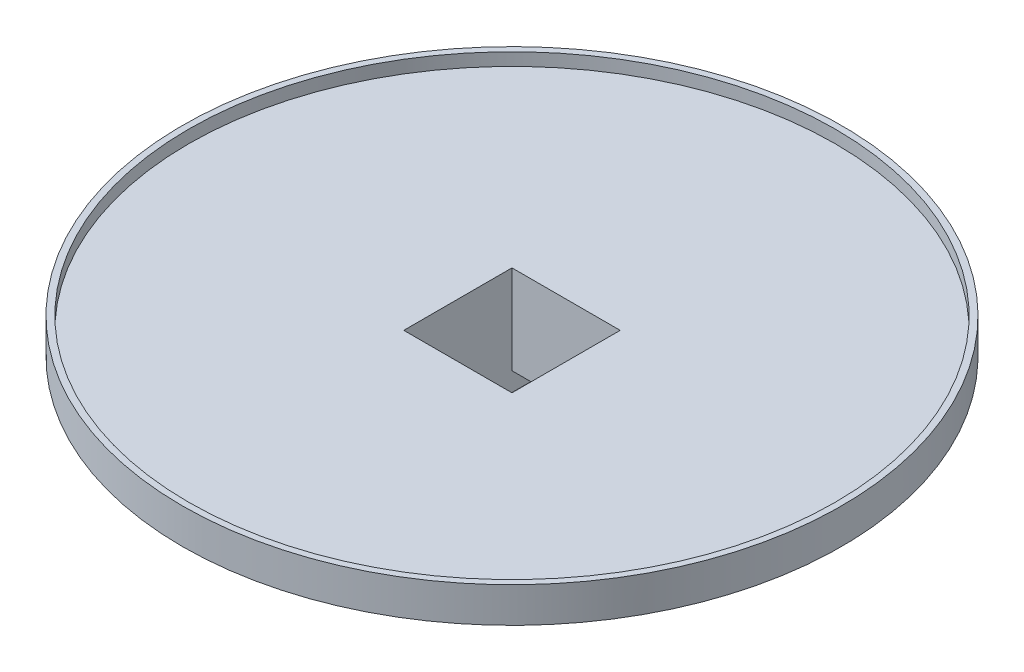
ISO-10303-21;
HEADER;
FILE_DESCRIPTION(('STEP AP214'),'2;1');
FILE_NAME('part.step','',(''),(''),'','','');
FILE_SCHEMA(('AUTOMOTIVE_DESIGN { 1 0 10303 214 1 1 1 1 }'));
ENDSEC;
DATA;
#1=APPLICATION_CONTEXT('core data for automotive mechanical design processes');
#2=APPLICATION_PROTOCOL_DEFINITION('international standard','automotive_design',2000,#1);
#3=PRODUCT_CONTEXT('',#1,'mechanical');
#4=PRODUCT('Part','Part','',(#3));
#5=PRODUCT_RELATED_PRODUCT_CATEGORY('part','',(#4));
#6=PRODUCT_DEFINITION_FORMATION('','',#4);
#7=PRODUCT_DEFINITION_CONTEXT('part definition',#1,'design');
#8=PRODUCT_DEFINITION('design','',#6,#7);
#9=PRODUCT_DEFINITION_SHAPE('','',#8);
#10=(LENGTH_UNIT() NAMED_UNIT(*) SI_UNIT(.MILLI.,.METRE.));
#11=(NAMED_UNIT(*) PLANE_ANGLE_UNIT() SI_UNIT($,.RADIAN.));
#12=(NAMED_UNIT(*) SI_UNIT($,.STERADIAN.) SOLID_ANGLE_UNIT());
#13=UNCERTAINTY_MEASURE_WITH_UNIT(LENGTH_MEASURE(1.E-05),#10,'distance_accuracy_value','');
#14=(GEOMETRIC_REPRESENTATION_CONTEXT(3) GLOBAL_UNCERTAINTY_ASSIGNED_CONTEXT((#13)) GLOBAL_UNIT_ASSIGNED_CONTEXT((#10,
#11,#12)) REPRESENTATION_CONTEXT('',''));
#15=CARTESIAN_POINT('',(0.,0.,0.));
#16=DIRECTION('',(0.,0.,1.));
#17=DIRECTION('',(1.,0.,0.));
#18=AXIS2_PLACEMENT_3D('',#15,#16,#17);
#19=CARTESIAN_POINT('',(0.,-7.08,0.));
#20=DIRECTION('',(0.,-1.,0.));
#21=DIRECTION('',(0.,0.,-1.));
#22=AXIS2_PLACEMENT_3D('',#19,#20,#21);
#23=PLANE('',#22);
#24=DIRECTION('',(0.,0.,1.));
#25=VECTOR('',#24,1.);
#26=CARTESIAN_POINT('',(-4.3,-7.08,-14.1));
#27=LINE('',#26,#25);
#28=CARTESIAN_POINT('',(-4.3,-7.08,-6.3874877690685));
#29=VERTEX_POINT('',#28);
#30=CARTESIAN_POINT('',(-4.3,-7.08,-4.3));
#31=VERTEX_POINT('',#30);
#32=EDGE_CURVE('E127',#29,#31,#27,.T.);
#33=ORIENTED_EDGE('',*,*,#32,.F.);
#34=CARTESIAN_POINT('',(0.,-7.08,0.));
#35=DIRECTION('',(0.,-1.,0.));
#36=DIRECTION('',(0.,0.,-1.));
#37=AXIS2_PLACEMENT_3D('',#34,#35,#36);
#38=CIRCLE('',#37,7.69999999999999);
#39=CARTESIAN_POINT('',(4.3,-7.08,-6.38748776906849));
#40=VERTEX_POINT('',#39);
#41=EDGE_CURVE('E246',#29,#40,#38,.T.);
#42=ORIENTED_EDGE('',*,*,#41,.T.);
#43=DIRECTION('',(0.,0.,1.));
#44=VECTOR('',#43,1.);
#45=CARTESIAN_POINT('',(4.3,-7.08,-14.1));
#46=LINE('',#45,#44);
#47=CARTESIAN_POINT('',(4.3,-7.08,-4.3));
#48=VERTEX_POINT('',#47);
#49=EDGE_CURVE('E112',#40,#48,#46,.T.);
#50=ORIENTED_EDGE('',*,*,#49,.T.);
#51=DIRECTION('',(1.,0.,0.));
#52=VECTOR('',#51,1.);
#53=CARTESIAN_POINT('',(-4.3,-7.08,-4.3));
#54=LINE('',#53,#52);
#55=EDGE_CURVE('E284',#31,#48,#54,.T.);
#56=ORIENTED_EDGE('',*,*,#55,.F.);
#57=EDGE_LOOP('',(#33,#42,#50,#56));
#58=FACE_BOUND('',#57,.T.);
#59=ADVANCED_FACE('F101',(#58),#23,.T.);
#60=CARTESIAN_POINT('',(4.3,-7.08,4.3));
#61=VERTEX_POINT('',#60);
#62=CARTESIAN_POINT('',(4.3,-7.08,6.38748776906852));
#63=VERTEX_POINT('',#62);
#64=EDGE_CURVE('E12',#61,#63,#46,.T.);
#65=ORIENTED_EDGE('',*,*,#64,.T.);
#66=CARTESIAN_POINT('',(-4.3,-7.08,6.38748776906853));
#67=VERTEX_POINT('',#66);
#68=EDGE_CURVE('E249',#63,#67,#38,.T.);
#69=ORIENTED_EDGE('',*,*,#68,.T.);
#70=CARTESIAN_POINT('',(-4.3,-7.08,4.3));
#71=VERTEX_POINT('',#70);
#72=EDGE_CURVE('E320',#71,#67,#27,.T.);
#73=ORIENTED_EDGE('',*,*,#72,.F.);
#74=DIRECTION('',(-1.,0.,0.));
#75=VECTOR('',#74,1.);
#76=CARTESIAN_POINT('',(-4.3,-7.08,4.3));
#77=LINE('',#76,#75);
#78=EDGE_CURVE('E281',#61,#71,#77,.T.);
#79=ORIENTED_EDGE('',*,*,#78,.F.);
#80=EDGE_LOOP('',(#65,#69,#73,#79));
#81=FACE_BOUND('',#80,.T.);
#82=ADVANCED_FACE('F325',(#81),#23,.T.);
#83=CARTESIAN_POINT('',(0.,-81.1565063971027,0.));
#84=DIRECTION('',(0.,1.,0.));
#85=DIRECTION('',(0.,0.,1.));
#86=AXIS2_PLACEMENT_3D('',#83,#84,#85);
#87=CYLINDRICAL_SURFACE('',#86,26.19);
#88=CARTESIAN_POINT('',(0.,1.01,0.));
#89=DIRECTION('',(0.,1.,0.));
#90=DIRECTION('',(0.,0.,1.));
#91=AXIS2_PLACEMENT_3D('',#88,#89,#90);
#92=CIRCLE('',#91,26.19);
#93=CARTESIAN_POINT('',(0.,1.01,26.19));
#94=VERTEX_POINT('',#93);
#95=EDGE_CURVE('E370',#94,#94,#92,.T.);
#96=ORIENTED_EDGE('',*,*,#95,.F.);
#97=EDGE_LOOP('',(#96));
#98=FACE_BOUND('',#97,.T.);
#99=CARTESIAN_POINT('',(0.,-1.79,0.));
#100=DIRECTION('',(0.,-1.,0.));
#101=DIRECTION('',(0.,0.,-1.));
#102=AXIS2_PLACEMENT_3D('',#99,#100,#101);
#103=CIRCLE('',#102,26.19);
#104=CARTESIAN_POINT('',(0.,-1.79,-26.19));
#105=VERTEX_POINT('',#104);
#106=EDGE_CURVE('E250',#105,#105,#103,.T.);
#107=ORIENTED_EDGE('',*,*,#106,.F.);
#108=EDGE_LOOP('',(#107));
#109=FACE_BOUND('',#108,.T.);
#110=ADVANCED_FACE('F311',(#98,#109),#87,.T.);
#111=CARTESIAN_POINT('',(0.,0.,0.));
#112=DIRECTION('',(0.,-1.,0.));
#113=DIRECTION('',(0.,0.,-1.));
#114=AXIS2_PLACEMENT_3D('',#111,#112,#113);
#115=PLANE('',#114);
#116=CARTESIAN_POINT('',(0.,0.,0.));
#117=DIRECTION('',(0.,-1.,0.));
#118=DIRECTION('',(0.,0.,-1.));
#119=AXIS2_PLACEMENT_3D('',#116,#117,#118);
#120=CIRCLE('',#119,25.69);
#121=CARTESIAN_POINT('',(0.,0.,-25.69));
#122=VERTEX_POINT('',#121);
#123=EDGE_CURVE('E105',#122,#122,#120,.T.);
#124=ORIENTED_EDGE('',*,*,#123,.F.);
#125=EDGE_LOOP('',(#124));
#126=FACE_BOUND('',#125,.T.);
#127=DIRECTION('',(0.,0.,1.));
#128=VECTOR('',#127,1.);
#129=CARTESIAN_POINT('',(4.3,0.,-4.3));
#130=LINE('',#129,#128);
#131=CARTESIAN_POINT('',(4.3,0.,-4.3));
#132=VERTEX_POINT('',#131);
#133=CARTESIAN_POINT('',(4.3,0.,4.3));
#134=VERTEX_POINT('',#133);
#135=EDGE_CURVE('E271',#132,#134,#130,.T.);
#136=ORIENTED_EDGE('',*,*,#135,.T.);
#137=DIRECTION('',(-1.,0.,0.));
#138=VECTOR('',#137,1.);
#139=CARTESIAN_POINT('',(-4.3,0.,4.3));
#140=LINE('',#139,#138);
#141=CARTESIAN_POINT('',(-4.3,0.,4.3));
#142=VERTEX_POINT('',#141);
#143=EDGE_CURVE('E289',#134,#142,#140,.T.);
#144=ORIENTED_EDGE('',*,*,#143,.T.);
#145=DIRECTION('',(0.,0.,-1.));
#146=VECTOR('',#145,1.);
#147=CARTESIAN_POINT('',(-4.3,0.,-4.3));
#148=LINE('',#147,#146);
#149=CARTESIAN_POINT('',(-4.3,0.,-4.3));
#150=VERTEX_POINT('',#149);
#151=EDGE_CURVE('E292',#142,#150,#148,.T.);
#152=ORIENTED_EDGE('',*,*,#151,.T.);
#153=DIRECTION('',(1.,0.,0.));
#154=VECTOR('',#153,1.);
#155=CARTESIAN_POINT('',(-4.3,0.,-4.3));
#156=LINE('',#155,#154);
#157=EDGE_CURVE('E285',#150,#132,#156,.T.);
#158=ORIENTED_EDGE('',*,*,#157,.T.);
#159=EDGE_LOOP('',(#136,#144,#152,#158));
#160=FACE_BOUND('',#159,.T.);
#161=ADVANCED_FACE('F103',(#126,#160),#115,.F.);
#162=CARTESIAN_POINT('',(4.3,-7.08,-4.3));
#163=DIRECTION('',(-1.,0.,0.));
#164=DIRECTION('',(0.,0.,1.));
#165=AXIS2_PLACEMENT_3D('',#162,#163,#164);
#166=PLANE('',#165);
#167=ORIENTED_EDGE('',*,*,#135,.F.);
#168=DIRECTION('',(0.,1.,0.));
#169=VECTOR('',#168,1.);
#170=CARTESIAN_POINT('',(4.3,-7.08,-4.3));
#171=LINE('',#170,#169);
#172=EDGE_CURVE('E260',#48,#132,#171,.T.);
#173=ORIENTED_EDGE('',*,*,#172,.F.);
#174=ORIENTED_EDGE('',*,*,#49,.F.);
#175=CARTESIAN_POINT('',(4.3,-7.08,-14.1));
#176=VERTEX_POINT('',#175);
#177=EDGE_CURVE('E111',#176,#40,#46,.T.);
#178=ORIENTED_EDGE('',*,*,#177,.F.);
#179=DIRECTION('',(0.,1.,0.));
#180=VECTOR('',#179,1.);
#181=CARTESIAN_POINT('',(4.3,-8.58,-14.1));
#182=LINE('',#181,#180);
#183=CARTESIAN_POINT('',(4.3,-8.58,-14.1));
#184=VERTEX_POINT('',#183);
#185=EDGE_CURVE('E275',#184,#176,#182,.T.);
#186=ORIENTED_EDGE('',*,*,#185,.F.);
#187=DIRECTION('',(0.,0.,1.));
#188=VECTOR('',#187,1.);
#189=CARTESIAN_POINT('',(4.3,-8.58,-14.1));
#190=LINE('',#189,#188);
#191=CARTESIAN_POINT('',(4.3,-8.58,9.9));
#192=VERTEX_POINT('',#191);
#193=EDGE_CURVE('E428',#184,#192,#190,.T.);
#194=ORIENTED_EDGE('',*,*,#193,.T.);
#195=DIRECTION('',(0.,1.,0.));
#196=VECTOR('',#195,1.);
#197=CARTESIAN_POINT('',(4.3,-8.58,9.9));
#198=LINE('',#197,#196);
#199=CARTESIAN_POINT('',(4.3,-7.08,9.9));
#200=VERTEX_POINT('',#199);
#201=EDGE_CURVE('E272',#192,#200,#198,.T.);
#202=ORIENTED_EDGE('',*,*,#201,.T.);
#203=DIRECTION('',(0.,0.,-1.));
#204=VECTOR('',#203,1.);
#205=CARTESIAN_POINT('',(4.3,-7.08,-4.3));
#206=LINE('',#205,#204);
#207=EDGE_CURVE('E326',#200,#63,#206,.T.);
#208=ORIENTED_EDGE('',*,*,#207,.T.);
#209=ORIENTED_EDGE('',*,*,#64,.F.);
#210=DIRECTION('',(0.,1.,0.));
#211=VECTOR('',#210,1.);
#212=CARTESIAN_POINT('',(4.3,-7.08,4.3));
#213=LINE('',#212,#211);
#214=EDGE_CURVE('E301',#61,#134,#213,.T.);
#215=ORIENTED_EDGE('',*,*,#214,.T.);
#216=EDGE_LOOP('',(#167,#173,#174,#178,#186,#194,#202,#208,#209,#215));
#217=FACE_BOUND('',#216,.T.);
#218=ADVANCED_FACE('F258',(#217),#166,.T.);
#219=CARTESIAN_POINT('',(-4.3,-7.08,4.3));
#220=DIRECTION('',(0.,0.,-1.));
#221=DIRECTION('',(-1.,0.,0.));
#222=AXIS2_PLACEMENT_3D('',#219,#220,#221);
#223=PLANE('',#222);
#224=ORIENTED_EDGE('',*,*,#143,.F.);
#225=ORIENTED_EDGE('',*,*,#214,.F.);
#226=ORIENTED_EDGE('',*,*,#78,.T.);
#227=DIRECTION('',(0.,1.,0.));
#228=VECTOR('',#227,1.);
#229=CARTESIAN_POINT('',(-4.3,-7.08,4.3));
#230=LINE('',#229,#228);
#231=EDGE_CURVE('E300',#71,#142,#230,.T.);
#232=ORIENTED_EDGE('',*,*,#231,.T.);
#233=EDGE_LOOP('',(#224,#225,#226,#232));
#234=FACE_BOUND('',#233,.T.);
#235=ADVANCED_FACE('F322',(#234),#223,.T.);
#236=CARTESIAN_POINT('',(-4.3,-7.08,-4.3));
#237=DIRECTION('',(1.,0.,0.));
#238=DIRECTION('',(0.,0.,-1.));
#239=AXIS2_PLACEMENT_3D('',#236,#237,#238);
#240=PLANE('',#239);
#241=ORIENTED_EDGE('',*,*,#151,.F.);
#242=ORIENTED_EDGE('',*,*,#231,.F.);
#243=ORIENTED_EDGE('',*,*,#72,.T.);
#244=DIRECTION('',(0.,0.,1.));
#245=VECTOR('',#244,1.);
#246=CARTESIAN_POINT('',(-4.3,-7.08,-4.3));
#247=LINE('',#246,#245);
#248=CARTESIAN_POINT('',(-4.3,-7.08,9.9));
#249=VERTEX_POINT('',#248);
#250=EDGE_CURVE('E330',#67,#249,#247,.T.);
#251=ORIENTED_EDGE('',*,*,#250,.T.);
#252=DIRECTION('',(0.,1.,0.));
#253=VECTOR('',#252,1.);
#254=CARTESIAN_POINT('',(-4.3,-8.58,9.9));
#255=LINE('',#254,#253);
#256=CARTESIAN_POINT('',(-4.3,-8.58,9.9));
#257=VERTEX_POINT('',#256);
#258=EDGE_CURVE('E381',#257,#249,#255,.T.);
#259=ORIENTED_EDGE('',*,*,#258,.F.);
#260=DIRECTION('',(0.,0.,1.));
#261=VECTOR('',#260,1.);
#262=CARTESIAN_POINT('',(-4.3,-8.58,-14.1));
#263=LINE('',#262,#261);
#264=CARTESIAN_POINT('',(-4.3,-8.58,-14.1));
#265=VERTEX_POINT('',#264);
#266=EDGE_CURVE('E377',#265,#257,#263,.T.);
#267=ORIENTED_EDGE('',*,*,#266,.F.);
#268=DIRECTION('',(0.,1.,0.));
#269=VECTOR('',#268,1.);
#270=CARTESIAN_POINT('',(-4.3,-8.58,-14.1));
#271=LINE('',#270,#269);
#272=CARTESIAN_POINT('',(-4.3,-7.08,-14.1));
#273=VERTEX_POINT('',#272);
#274=EDGE_CURVE('E373',#265,#273,#271,.T.);
#275=ORIENTED_EDGE('',*,*,#274,.T.);
#276=EDGE_CURVE('E386',#273,#29,#27,.T.);
#277=ORIENTED_EDGE('',*,*,#276,.T.);
#278=ORIENTED_EDGE('',*,*,#32,.T.);
#279=DIRECTION('',(0.,1.,0.));
#280=VECTOR('',#279,1.);
#281=CARTESIAN_POINT('',(-4.3,-7.08,-4.3));
#282=LINE('',#281,#280);
#283=EDGE_CURVE('E298',#31,#150,#282,.T.);
#284=ORIENTED_EDGE('',*,*,#283,.T.);
#285=EDGE_LOOP('',(#241,#242,#243,#251,#259,#267,#275,#277,#278,#284));
#286=FACE_BOUND('',#285,.T.);
#287=ADVANCED_FACE('F316',(#286),#240,.T.);
#288=CARTESIAN_POINT('',(-4.3,-7.08,-4.3));
#289=DIRECTION('',(0.,0.,1.));
#290=DIRECTION('',(1.,0.,0.));
#291=AXIS2_PLACEMENT_3D('',#288,#289,#290);
#292=PLANE('',#291);
#293=ORIENTED_EDGE('',*,*,#157,.F.);
#294=ORIENTED_EDGE('',*,*,#283,.F.);
#295=ORIENTED_EDGE('',*,*,#55,.T.);
#296=ORIENTED_EDGE('',*,*,#172,.T.);
#297=EDGE_LOOP('',(#293,#294,#295,#296));
#298=FACE_BOUND('',#297,.T.);
#299=ADVANCED_FACE('F314',(#298),#292,.T.);
#300=CARTESIAN_POINT('',(0.,-8.58,0.));
#301=DIRECTION('',(0.,1.,0.));
#302=DIRECTION('',(0.,0.,1.));
#303=AXIS2_PLACEMENT_3D('',#300,#301,#302);
#304=PLANE('',#303);
#305=DIRECTION('',(0.,0.,-1.));
#306=VECTOR('',#305,1.);
#307=CARTESIAN_POINT('',(9.9,-8.58,-8.1));
#308=LINE('',#307,#306);
#309=CARTESIAN_POINT('',(9.9,-8.58,-8.1));
#310=VERTEX_POINT('',#309);
#311=CARTESIAN_POINT('',(9.9,-8.58,-11.1));
#312=VERTEX_POINT('',#311);
#313=EDGE_CURVE('E351',#310,#312,#308,.T.);
#314=ORIENTED_EDGE('',*,*,#313,.T.);
#315=DIRECTION('',(1.,0.,0.));
#316=VECTOR('',#315,1.);
#317=CARTESIAN_POINT('',(5.9,-8.58,-11.1));
#318=LINE('',#317,#316);
#319=CARTESIAN_POINT('',(5.9,-8.58,-11.1));
#320=VERTEX_POINT('',#319);
#321=EDGE_CURVE('E119',#320,#312,#318,.T.);
#322=ORIENTED_EDGE('',*,*,#321,.F.);
#323=DIRECTION('',(0.,0.,-1.));
#324=VECTOR('',#323,1.);
#325=CARTESIAN_POINT('',(5.9,-8.58,-8.1));
#326=LINE('',#325,#324);
#327=CARTESIAN_POINT('',(5.9,-8.58,-8.1));
#328=VERTEX_POINT('',#327);
#329=EDGE_CURVE('E342',#328,#320,#326,.T.);
#330=ORIENTED_EDGE('',*,*,#329,.F.);
#331=DIRECTION('',(1.,0.,0.));
#332=VECTOR('',#331,1.);
#333=CARTESIAN_POINT('',(5.9,-8.58,-8.1));
#334=LINE('',#333,#332);
#335=EDGE_CURVE('E355',#328,#310,#334,.T.);
#336=ORIENTED_EDGE('',*,*,#335,.T.);
#337=EDGE_LOOP('',(#314,#322,#330,#336));
#338=FACE_BOUND('',#337,.T.);
#339=DIRECTION('',(0.,0.,-1.));
#340=VECTOR('',#339,1.);
#341=CARTESIAN_POINT('',(12.5,-8.58,9.9));
#342=LINE('',#341,#340);
#343=CARTESIAN_POINT('',(12.5,-8.58,9.9));
#344=VERTEX_POINT('',#343);
#345=CARTESIAN_POINT('',(12.5,-8.58,-14.1));
#346=VERTEX_POINT('',#345);
#347=EDGE_CURVE('E267',#344,#346,#342,.T.);
#348=ORIENTED_EDGE('',*,*,#347,.F.);
#349=DIRECTION('',(-1.,0.,0.));
#350=VECTOR('',#349,1.);
#351=CARTESIAN_POINT('',(12.5,-8.58,9.9));
#352=LINE('',#351,#350);
#353=EDGE_CURVE('E280',#344,#192,#352,.T.);
#354=ORIENTED_EDGE('',*,*,#353,.T.);
#355=ORIENTED_EDGE('',*,*,#193,.F.);
#356=DIRECTION('',(-1.,0.,0.));
#357=VECTOR('',#356,1.);
#358=CARTESIAN_POINT('',(12.5,-8.58,-14.1));
#359=LINE('',#358,#357);
#360=EDGE_CURVE('E425',#346,#184,#359,.T.);
#361=ORIENTED_EDGE('',*,*,#360,.F.);
#362=EDGE_LOOP('',(#348,#354,#355,#361));
#363=FACE_BOUND('',#362,.T.);
#364=CARTESIAN_POINT('',(10.75,-8.58,-12.5));
#365=DIRECTION('',(0.,-1.,0.));
#366=DIRECTION('',(0.,0.,-1.));
#367=AXIS2_PLACEMENT_3D('',#364,#365,#366);
#368=CIRCLE('',#367,1.125);
#369=CARTESIAN_POINT('',(10.75,-8.58,-13.625));
#370=VERTEX_POINT('',#369);
#371=EDGE_CURVE('E416',#370,#370,#368,.T.);
#372=ORIENTED_EDGE('',*,*,#371,.F.);
#373=EDGE_LOOP('',(#372));
#374=FACE_BOUND('',#373,.T.);
#375=CARTESIAN_POINT('',(10.75,-8.58,0.3));
#376=DIRECTION('',(0.,-1.,0.));
#377=DIRECTION('',(0.,0.,-1.));
#378=AXIS2_PLACEMENT_3D('',#375,#376,#377);
#379=CIRCLE('',#378,1.125);
#380=CARTESIAN_POINT('',(10.75,-8.58,-0.825));
#381=VERTEX_POINT('',#380);
#382=EDGE_CURVE('E413',#381,#381,#379,.T.);
#383=ORIENTED_EDGE('',*,*,#382,.F.);
#384=EDGE_LOOP('',(#383));
#385=FACE_BOUND('',#384,.T.);
#386=ADVANCED_FACE('F439',(#338,#363,#374,#385),#304,.F.);
#387=CARTESIAN_POINT('',(12.5,-8.58,9.9));
#388=DIRECTION('',(1.,0.,0.));
#389=DIRECTION('',(0.,0.,-1.));
#390=AXIS2_PLACEMENT_3D('',#387,#388,#389);
#391=PLANE('',#390);
#392=DIRECTION('',(0.,0.,-1.));
#393=VECTOR('',#392,1.);
#394=CARTESIAN_POINT('',(12.5,-7.08,9.9));
#395=LINE('',#394,#393);
#396=CARTESIAN_POINT('',(12.5,-7.08,9.9));
#397=VERTEX_POINT('',#396);
#398=CARTESIAN_POINT('',(12.5,-7.08,-14.1));
#399=VERTEX_POINT('',#398);
#400=EDGE_CURVE('E261',#397,#399,#395,.T.);
#401=ORIENTED_EDGE('',*,*,#400,.F.);
#402=DIRECTION('',(0.,1.,0.));
#403=VECTOR('',#402,1.);
#404=CARTESIAN_POINT('',(12.5,-8.58,9.9));
#405=LINE('',#404,#403);
#406=EDGE_CURVE('E268',#344,#397,#405,.T.);
#407=ORIENTED_EDGE('',*,*,#406,.F.);
#408=ORIENTED_EDGE('',*,*,#347,.T.);
#409=DIRECTION('',(0.,1.,0.));
#410=VECTOR('',#409,1.);
#411=CARTESIAN_POINT('',(12.5,-8.58,-14.1));
#412=LINE('',#411,#410);
#413=EDGE_CURVE('E277',#346,#399,#412,.T.);
#414=ORIENTED_EDGE('',*,*,#413,.T.);
#415=EDGE_LOOP('',(#401,#407,#408,#414));
#416=FACE_BOUND('',#415,.T.);
#417=ADVANCED_FACE('F432',(#416),#391,.T.);
#418=CARTESIAN_POINT('',(12.5,-8.58,9.9));
#419=DIRECTION('',(0.,0.,-1.));
#420=DIRECTION('',(-1.,0.,0.));
#421=AXIS2_PLACEMENT_3D('',#418,#419,#420);
#422=PLANE('',#421);
#423=DIRECTION('',(-1.,0.,0.));
#424=VECTOR('',#423,1.);
#425=CARTESIAN_POINT('',(12.5,-7.08,9.9));
#426=LINE('',#425,#424);
#427=EDGE_CURVE('E241',#397,#200,#426,.T.);
#428=ORIENTED_EDGE('',*,*,#427,.T.);
#429=ORIENTED_EDGE('',*,*,#201,.F.);
#430=ORIENTED_EDGE('',*,*,#353,.F.);
#431=ORIENTED_EDGE('',*,*,#406,.T.);
#432=EDGE_LOOP('',(#428,#429,#430,#431));
#433=FACE_BOUND('',#432,.T.);
#434=ADVANCED_FACE('F443',(#433),#422,.F.);
#435=CARTESIAN_POINT('',(12.5,-8.58,-14.1));
#436=DIRECTION('',(0.,0.,-1.));
#437=DIRECTION('',(-1.,0.,0.));
#438=AXIS2_PLACEMENT_3D('',#435,#436,#437);
#439=PLANE('',#438);
#440=DIRECTION('',(-1.,0.,0.));
#441=VECTOR('',#440,1.);
#442=CARTESIAN_POINT('',(12.5,-7.08,-14.1));
#443=LINE('',#442,#441);
#444=EDGE_CURVE('E237',#399,#176,#443,.T.);
#445=ORIENTED_EDGE('',*,*,#444,.F.);
#446=ORIENTED_EDGE('',*,*,#413,.F.);
#447=ORIENTED_EDGE('',*,*,#360,.T.);
#448=ORIENTED_EDGE('',*,*,#185,.T.);
#449=EDGE_LOOP('',(#445,#446,#447,#448));
#450=FACE_BOUND('',#449,.T.);
#451=ADVANCED_FACE('F436',(#450),#439,.T.);
#452=CARTESIAN_POINT('',(10.75,-8.58,-12.5));
#453=DIRECTION('',(0.,1.,0.));
#454=DIRECTION('',(0.,0.,1.));
#455=AXIS2_PLACEMENT_3D('',#452,#453,#454);
#456=CYLINDRICAL_SURFACE('',#455,1.125);
#457=ORIENTED_EDGE('',*,*,#371,.T.);
#458=EDGE_LOOP('',(#457));
#459=FACE_BOUND('',#458,.T.);
#460=CARTESIAN_POINT('',(10.75,-7.08,-12.5));
#461=DIRECTION('',(0.,-1.,0.));
#462=DIRECTION('',(0.,0.,-1.));
#463=AXIS2_PLACEMENT_3D('',#460,#461,#462);
#464=CIRCLE('',#463,1.125);
#465=CARTESIAN_POINT('',(10.75,-7.08,-13.625));
#466=VERTEX_POINT('',#465);
#467=EDGE_CURVE('E352',#466,#466,#464,.T.);
#468=ORIENTED_EDGE('',*,*,#467,.F.);
#469=EDGE_LOOP('',(#468));
#470=FACE_BOUND('',#469,.T.);
#471=ADVANCED_FACE('F450',(#459,#470),#456,.F.);
#472=CARTESIAN_POINT('',(10.75,-8.58,0.3));
#473=DIRECTION('',(0.,1.,0.));
#474=DIRECTION('',(0.,0.,1.));
#475=AXIS2_PLACEMENT_3D('',#472,#473,#474);
#476=CYLINDRICAL_SURFACE('',#475,1.125);
#477=ORIENTED_EDGE('',*,*,#382,.T.);
#478=EDGE_LOOP('',(#477));
#479=FACE_BOUND('',#478,.T.);
#480=CARTESIAN_POINT('',(10.75,-7.08,0.3));
#481=DIRECTION('',(0.,-1.,0.));
#482=DIRECTION('',(0.,0.,-1.));
#483=AXIS2_PLACEMENT_3D('',#480,#481,#482);
#484=CIRCLE('',#483,1.125);
#485=CARTESIAN_POINT('',(10.75,-7.08,-0.825));
#486=VERTEX_POINT('',#485);
#487=EDGE_CURVE('E410',#486,#486,#484,.T.);
#488=ORIENTED_EDGE('',*,*,#487,.F.);
#489=EDGE_LOOP('',(#488));
#490=FACE_BOUND('',#489,.T.);
#491=ADVANCED_FACE('F478',(#479,#490),#476,.F.);
#492=CARTESIAN_POINT('',(-4.3,-8.58,-14.1));
#493=DIRECTION('',(0.,0.,-1.));
#494=DIRECTION('',(-1.,0.,0.));
#495=AXIS2_PLACEMENT_3D('',#492,#493,#494);
#496=PLANE('',#495);
#497=DIRECTION('',(-1.,0.,0.));
#498=VECTOR('',#497,1.);
#499=CARTESIAN_POINT('',(-4.3,-7.08,-14.1));
#500=LINE('',#499,#498);
#501=CARTESIAN_POINT('',(-12.5,-7.08,-14.1));
#502=VERTEX_POINT('',#501);
#503=EDGE_CURVE('E394',#273,#502,#500,.T.);
#504=ORIENTED_EDGE('',*,*,#503,.F.);
#505=ORIENTED_EDGE('',*,*,#274,.F.);
#506=DIRECTION('',(-1.,0.,0.));
#507=VECTOR('',#506,1.);
#508=CARTESIAN_POINT('',(-4.3,-8.58,-14.1));
#509=LINE('',#508,#507);
#510=CARTESIAN_POINT('',(-12.5,-8.58,-14.1));
#511=VERTEX_POINT('',#510);
#512=EDGE_CURVE('E402',#265,#511,#509,.T.);
#513=ORIENTED_EDGE('',*,*,#512,.T.);
#514=DIRECTION('',(0.,1.,0.));
#515=VECTOR('',#514,1.);
#516=CARTESIAN_POINT('',(-12.5,-8.58,-14.1));
#517=LINE('',#516,#515);
#518=EDGE_CURVE('E374',#511,#502,#517,.T.);
#519=ORIENTED_EDGE('',*,*,#518,.T.);
#520=EDGE_LOOP('',(#504,#505,#513,#519));
#521=FACE_BOUND('',#520,.T.);
#522=ADVANCED_FACE('F482',(#521),#496,.T.);
#523=CARTESIAN_POINT('',(-4.3,-8.58,9.9));
#524=DIRECTION('',(0.,0.,-1.));
#525=DIRECTION('',(-1.,0.,0.));
#526=AXIS2_PLACEMENT_3D('',#523,#524,#525);
#527=PLANE('',#526);
#528=DIRECTION('',(-1.,0.,0.));
#529=VECTOR('',#528,1.);
#530=CARTESIAN_POINT('',(-4.3,-7.08,9.9));
#531=LINE('',#530,#529);
#532=CARTESIAN_POINT('',(-12.5,-7.08,9.9));
#533=VERTEX_POINT('',#532);
#534=EDGE_CURVE('E388',#249,#533,#531,.T.);
#535=ORIENTED_EDGE('',*,*,#534,.T.);
#536=DIRECTION('',(0.,1.,0.));
#537=VECTOR('',#536,1.);
#538=CARTESIAN_POINT('',(-12.5,-8.58,9.9));
#539=LINE('',#538,#537);
#540=CARTESIAN_POINT('',(-12.5,-8.58,9.9));
#541=VERTEX_POINT('',#540);
#542=EDGE_CURVE('E378',#541,#533,#539,.T.);
#543=ORIENTED_EDGE('',*,*,#542,.F.);
#544=DIRECTION('',(-1.,0.,0.));
#545=VECTOR('',#544,1.);
#546=CARTESIAN_POINT('',(-4.3,-8.58,9.9));
#547=LINE('',#546,#545);
#548=EDGE_CURVE('E398',#257,#541,#547,.T.);
#549=ORIENTED_EDGE('',*,*,#548,.F.);
#550=ORIENTED_EDGE('',*,*,#258,.T.);
#551=EDGE_LOOP('',(#535,#543,#549,#550));
#552=FACE_BOUND('',#551,.T.);
#553=ADVANCED_FACE('F497',(#552),#527,.F.);
#554=CARTESIAN_POINT('',(-12.5,-8.58,9.9));
#555=DIRECTION('',(1.,0.,0.));
#556=DIRECTION('',(0.,0.,-1.));
#557=AXIS2_PLACEMENT_3D('',#554,#555,#556);
#558=PLANE('',#557);
#559=DIRECTION('',(0.,0.,-1.));
#560=VECTOR('',#559,1.);
#561=CARTESIAN_POINT('',(-12.5,-7.08,9.9));
#562=LINE('',#561,#560);
#563=EDGE_CURVE('E391',#533,#502,#562,.T.);
#564=ORIENTED_EDGE('',*,*,#563,.T.);
#565=ORIENTED_EDGE('',*,*,#518,.F.);
#566=DIRECTION('',(0.,0.,-1.));
#567=VECTOR('',#566,1.);
#568=CARTESIAN_POINT('',(-12.5,-8.58,9.9));
#569=LINE('',#568,#567);
#570=EDGE_CURVE('E400',#541,#511,#569,.T.);
#571=ORIENTED_EDGE('',*,*,#570,.F.);
#572=ORIENTED_EDGE('',*,*,#542,.T.);
#573=EDGE_LOOP('',(#564,#565,#571,#572));
#574=FACE_BOUND('',#573,.T.);
#575=ADVANCED_FACE('F495',(#574),#558,.F.);
#576=CARTESIAN_POINT('',(0.,-8.58,0.));
#577=DIRECTION('',(0.,-1.,0.));
#578=DIRECTION('',(0.,0.,-1.));
#579=AXIS2_PLACEMENT_3D('',#576,#577,#578);
#580=PLANE('',#579);
#581=CARTESIAN_POINT('',(-10.25,-8.58,0.3));
#582=DIRECTION('',(0.,1.,0.));
#583=DIRECTION('',(0.,0.,1.));
#584=AXIS2_PLACEMENT_3D('',#581,#582,#583);
#585=CIRCLE('',#584,1.125);
#586=CARTESIAN_POINT('',(-10.25,-8.58,1.425));
#587=VERTEX_POINT('',#586);
#588=EDGE_CURVE('E407',#587,#587,#585,.T.);
#589=ORIENTED_EDGE('',*,*,#588,.T.);
#590=EDGE_LOOP('',(#589));
#591=FACE_BOUND('',#590,.T.);
#592=CARTESIAN_POINT('',(-10.25,-8.58,-12.5));
#593=DIRECTION('',(0.,1.,0.));
#594=DIRECTION('',(0.,0.,1.));
#595=AXIS2_PLACEMENT_3D('',#592,#593,#594);
#596=CIRCLE('',#595,1.125);
#597=CARTESIAN_POINT('',(-10.25,-8.58,-11.375));
#598=VERTEX_POINT('',#597);
#599=EDGE_CURVE('E396',#598,#598,#596,.T.);
#600=ORIENTED_EDGE('',*,*,#599,.T.);
#601=EDGE_LOOP('',(#600));
#602=FACE_BOUND('',#601,.T.);
#603=ORIENTED_EDGE('',*,*,#512,.F.);
#604=ORIENTED_EDGE('',*,*,#266,.T.);
#605=ORIENTED_EDGE('',*,*,#548,.T.);
#606=ORIENTED_EDGE('',*,*,#570,.T.);
#607=EDGE_LOOP('',(#603,#604,#605,#606));
#608=FACE_BOUND('',#607,.T.);
#609=ADVANCED_FACE('F491',(#591,#602,#608),#580,.T.);
#610=CARTESIAN_POINT('',(-10.25,-8.58,-12.5));
#611=DIRECTION('',(0.,1.,0.));
#612=DIRECTION('',(0.,0.,1.));
#613=AXIS2_PLACEMENT_3D('',#610,#611,#612);
#614=CYLINDRICAL_SURFACE('',#613,1.125);
#615=ORIENTED_EDGE('',*,*,#599,.F.);
#616=EDGE_LOOP('',(#615));
#617=FACE_BOUND('',#616,.T.);
#618=CARTESIAN_POINT('',(-10.25,-7.08,-12.5));
#619=DIRECTION('',(0.,1.,0.));
#620=DIRECTION('',(0.,0.,1.));
#621=AXIS2_PLACEMENT_3D('',#618,#619,#620);
#622=CIRCLE('',#621,1.125);
#623=CARTESIAN_POINT('',(-10.25,-7.08,-11.375));
#624=VERTEX_POINT('',#623);
#625=EDGE_CURVE('E329',#624,#624,#622,.T.);
#626=ORIENTED_EDGE('',*,*,#625,.T.);
#627=EDGE_LOOP('',(#626));
#628=FACE_BOUND('',#627,.T.);
#629=ADVANCED_FACE('F487',(#617,#628),#614,.F.);
#630=CARTESIAN_POINT('',(-10.25,-8.58,0.3));
#631=DIRECTION('',(0.,1.,0.));
#632=DIRECTION('',(0.,0.,1.));
#633=AXIS2_PLACEMENT_3D('',#630,#631,#632);
#634=CYLINDRICAL_SURFACE('',#633,1.125);
#635=ORIENTED_EDGE('',*,*,#588,.F.);
#636=EDGE_LOOP('',(#635));
#637=FACE_BOUND('',#636,.T.);
#638=CARTESIAN_POINT('',(-10.25,-7.08,0.3));
#639=DIRECTION('',(0.,1.,0.));
#640=DIRECTION('',(0.,0.,1.));
#641=AXIS2_PLACEMENT_3D('',#638,#639,#640);
#642=CIRCLE('',#641,1.125);
#643=CARTESIAN_POINT('',(-10.25,-7.08,1.425));
#644=VERTEX_POINT('',#643);
#645=EDGE_CURVE('E333',#644,#644,#642,.T.);
#646=ORIENTED_EDGE('',*,*,#645,.T.);
#647=EDGE_LOOP('',(#646));
#648=FACE_BOUND('',#647,.T.);
#649=ADVANCED_FACE('F484',(#637,#648),#634,.F.);
#650=CARTESIAN_POINT('',(0.,-81.1565063971027,0.));
#651=DIRECTION('',(0.,1.,0.));
#652=DIRECTION('',(0.,0.,1.));
#653=AXIS2_PLACEMENT_3D('',#650,#651,#652);
#654=CYLINDRICAL_SURFACE('',#653,25.69);
#655=CARTESIAN_POINT('',(0.,1.01,0.));
#656=DIRECTION('',(0.,1.,0.));
#657=DIRECTION('',(0.,0.,1.));
#658=AXIS2_PLACEMENT_3D('',#655,#656,#657);
#659=CIRCLE('',#658,25.69);
#660=CARTESIAN_POINT('',(0.,1.01,25.69));
#661=VERTEX_POINT('',#660);
#662=EDGE_CURVE('E362',#661,#661,#659,.T.);
#663=ORIENTED_EDGE('',*,*,#662,.T.);
#664=EDGE_LOOP('',(#663));
#665=FACE_BOUND('',#664,.T.);
#666=ORIENTED_EDGE('',*,*,#123,.T.);
#667=EDGE_LOOP('',(#666));
#668=FACE_BOUND('',#667,.T.);
#669=ADVANCED_FACE('F307',(#665,#668),#654,.F.);
#670=CARTESIAN_POINT('',(0.,1.01,0.));
#671=DIRECTION('',(0.,1.,0.));
#672=DIRECTION('',(0.,0.,1.));
#673=AXIS2_PLACEMENT_3D('',#670,#671,#672);
#674=PLANE('',#673);
#675=ORIENTED_EDGE('',*,*,#95,.T.);
#676=EDGE_LOOP('',(#675));
#677=FACE_BOUND('',#676,.T.);
#678=ORIENTED_EDGE('',*,*,#662,.F.);
#679=EDGE_LOOP('',(#678));
#680=FACE_BOUND('',#679,.T.);
#681=ADVANCED_FACE('F509',(#677,#680),#674,.T.);
#682=CARTESIAN_POINT('',(5.9,-7.88,-11.1));
#683=DIRECTION('',(0.,0.,-1.));
#684=DIRECTION('',(-1.,0.,0.));
#685=AXIS2_PLACEMENT_3D('',#682,#683,#684);
#686=PLANE('',#685);
#687=ORIENTED_EDGE('',*,*,#321,.T.);
#688=DIRECTION('',(0.,-1.,0.));
#689=VECTOR('',#688,1.);
#690=CARTESIAN_POINT('',(9.9,-7.88,-11.1));
#691=LINE('',#690,#689);
#692=CARTESIAN_POINT('',(9.9,-7.88,-11.1));
#693=VERTEX_POINT('',#692);
#694=EDGE_CURVE('E349',#693,#312,#691,.T.);
#695=ORIENTED_EDGE('',*,*,#694,.F.);
#696=DIRECTION('',(1.,0.,0.));
#697=VECTOR('',#696,1.);
#698=CARTESIAN_POINT('',(5.9,-7.88,-11.1));
#699=LINE('',#698,#697);
#700=CARTESIAN_POINT('',(5.9,-7.88,-11.1));
#701=VERTEX_POINT('',#700);
#702=EDGE_CURVE('E338',#701,#693,#699,.T.);
#703=ORIENTED_EDGE('',*,*,#702,.F.);
#704=DIRECTION('',(0.,-1.,0.));
#705=VECTOR('',#704,1.);
#706=CARTESIAN_POINT('',(5.9,-7.88,-11.1));
#707=LINE('',#706,#705);
#708=EDGE_CURVE('E360',#701,#320,#707,.T.);
#709=ORIENTED_EDGE('',*,*,#708,.T.);
#710=EDGE_LOOP('',(#687,#695,#703,#709));
#711=FACE_BOUND('',#710,.T.);
#712=ADVANCED_FACE('F515',(#711),#686,.F.);
#713=CARTESIAN_POINT('',(5.9,-7.88,-8.1));
#714=DIRECTION('',(-1.,0.,0.));
#715=DIRECTION('',(0.,0.,1.));
#716=AXIS2_PLACEMENT_3D('',#713,#714,#715);
#717=PLANE('',#716);
#718=ORIENTED_EDGE('',*,*,#329,.T.);
#719=ORIENTED_EDGE('',*,*,#708,.F.);
#720=DIRECTION('',(0.,0.,-1.));
#721=VECTOR('',#720,1.);
#722=CARTESIAN_POINT('',(5.9,-7.88,-8.1));
#723=LINE('',#722,#721);
#724=CARTESIAN_POINT('',(5.9,-7.88,-8.1));
#725=VERTEX_POINT('',#724);
#726=EDGE_CURVE('E346',#725,#701,#723,.T.);
#727=ORIENTED_EDGE('',*,*,#726,.F.);
#728=DIRECTION('',(0.,-1.,0.));
#729=VECTOR('',#728,1.);
#730=CARTESIAN_POINT('',(5.9,-7.88,-8.1));
#731=LINE('',#730,#729);
#732=EDGE_CURVE('E363',#725,#328,#731,.T.);
#733=ORIENTED_EDGE('',*,*,#732,.T.);
#734=EDGE_LOOP('',(#718,#719,#727,#733));
#735=FACE_BOUND('',#734,.T.);
#736=ADVANCED_FACE('F518',(#735),#717,.F.);
#737=CARTESIAN_POINT('',(5.9,-7.88,-8.1));
#738=DIRECTION('',(0.,0.,-1.));
#739=DIRECTION('',(-1.,0.,0.));
#740=AXIS2_PLACEMENT_3D('',#737,#738,#739);
#741=PLANE('',#740);
#742=ORIENTED_EDGE('',*,*,#335,.F.);
#743=ORIENTED_EDGE('',*,*,#732,.F.);
#744=DIRECTION('',(1.,0.,0.));
#745=VECTOR('',#744,1.);
#746=CARTESIAN_POINT('',(5.9,-7.88,-8.1));
#747=LINE('',#746,#745);
#748=CARTESIAN_POINT('',(9.9,-7.88,-8.1));
#749=VERTEX_POINT('',#748);
#750=EDGE_CURVE('E344',#725,#749,#747,.T.);
#751=ORIENTED_EDGE('',*,*,#750,.T.);
#752=DIRECTION('',(0.,-1.,0.));
#753=VECTOR('',#752,1.);
#754=CARTESIAN_POINT('',(9.9,-7.88,-8.1));
#755=LINE('',#754,#753);
#756=EDGE_CURVE('E365',#749,#310,#755,.T.);
#757=ORIENTED_EDGE('',*,*,#756,.T.);
#758=EDGE_LOOP('',(#742,#743,#751,#757));
#759=FACE_BOUND('',#758,.T.);
#760=ADVANCED_FACE('F523',(#759),#741,.T.);
#761=CARTESIAN_POINT('',(9.9,-7.88,-8.1));
#762=DIRECTION('',(-1.,0.,0.));
#763=DIRECTION('',(0.,0.,1.));
#764=AXIS2_PLACEMENT_3D('',#761,#762,#763);
#765=PLANE('',#764);
#766=ORIENTED_EDGE('',*,*,#313,.F.);
#767=ORIENTED_EDGE('',*,*,#756,.F.);
#768=DIRECTION('',(0.,0.,-1.));
#769=VECTOR('',#768,1.);
#770=CARTESIAN_POINT('',(9.9,-7.88,-8.1));
#771=LINE('',#770,#769);
#772=EDGE_CURVE('E341',#749,#693,#771,.T.);
#773=ORIENTED_EDGE('',*,*,#772,.T.);
#774=ORIENTED_EDGE('',*,*,#694,.T.);
#775=EDGE_LOOP('',(#766,#767,#773,#774));
#776=FACE_BOUND('',#775,.T.);
#777=ADVANCED_FACE('F519',(#776),#765,.T.);
#778=CARTESIAN_POINT('',(0.,-7.88,0.));
#779=DIRECTION('',(0.,1.,0.));
#780=DIRECTION('',(0.,0.,1.));
#781=AXIS2_PLACEMENT_3D('',#778,#779,#780);
#782=PLANE('',#781);
#783=ORIENTED_EDGE('',*,*,#702,.T.);
#784=ORIENTED_EDGE('',*,*,#772,.F.);
#785=ORIENTED_EDGE('',*,*,#750,.F.);
#786=ORIENTED_EDGE('',*,*,#726,.T.);
#787=EDGE_LOOP('',(#783,#784,#785,#786));
#788=FACE_BOUND('',#787,.T.);
#789=ADVANCED_FACE('F522',(#788),#782,.F.);
#790=CARTESIAN_POINT('',(-7.7,-7.08,0.));
#791=DIRECTION('',(0.,1.,0.));
#792=DIRECTION('',(0.,0.,1.));
#793=AXIS2_PLACEMENT_3D('',#790,#791,#792);
#794=PLANE('',#793);
#795=ORIENTED_EDGE('',*,*,#427,.F.);
#796=ORIENTED_EDGE('',*,*,#400,.T.);
#797=ORIENTED_EDGE('',*,*,#444,.T.);
#798=ORIENTED_EDGE('',*,*,#177,.T.);
#799=EDGE_CURVE('E234',#40,#63,#38,.T.);
#800=ORIENTED_EDGE('',*,*,#799,.T.);
#801=ORIENTED_EDGE('',*,*,#207,.F.);
#802=EDGE_LOOP('',(#795,#796,#797,#798,#800,#801));
#803=FACE_BOUND('',#802,.T.);
#804=ORIENTED_EDGE('',*,*,#487,.T.);
#805=EDGE_LOOP('',(#804));
#806=FACE_BOUND('',#805,.T.);
#807=ORIENTED_EDGE('',*,*,#467,.T.);
#808=EDGE_LOOP('',(#807));
#809=FACE_BOUND('',#808,.T.);
#810=ADVANCED_FACE('F232',(#803,#806,#809),#794,.T.);
#811=CARTESIAN_POINT('',(0.,-46.7896228727366,0.));
#812=DIRECTION('',(0.,-1.,0.));
#813=DIRECTION('',(0.,0.,-1.));
#814=AXIS2_PLACEMENT_3D('',#811,#812,#813);
#815=DEGENERATE_TOROIDAL_SURFACE('',#814,26.3742316788315,45.,.T.);
#816=ORIENTED_EDGE('',*,*,#106,.T.);
#817=EDGE_LOOP('',(#816));
#818=FACE_BOUND('',#817,.T.);
#819=CARTESIAN_POINT('',(0.,-4.40188153839243,0.));
#820=DIRECTION('',(0.,-1.,0.));
#821=DIRECTION('',(0.,0.,-1.));
#822=AXIS2_PLACEMENT_3D('',#819,#820,#821);
#823=CIRCLE('',#822,11.2653142929718);
#824=CARTESIAN_POINT('',(0.,-4.40188153839243,-11.2653142929718));
#825=VERTEX_POINT('',#824);
#826=EDGE_CURVE('E256',#825,#825,#823,.T.);
#827=ORIENTED_EDGE('',*,*,#826,.F.);
#828=EDGE_LOOP('',(#827));
#829=FACE_BOUND('',#828,.T.);
#830=ADVANCED_FACE('F533',(#818,#829),#815,.F.);
#831=ORIENTED_EDGE('',*,*,#645,.F.);
#832=EDGE_LOOP('',(#831));
#833=FACE_BOUND('',#832,.T.);
#834=ORIENTED_EDGE('',*,*,#625,.F.);
#835=EDGE_LOOP('',(#834));
#836=FACE_BOUND('',#835,.T.);
#837=ORIENTED_EDGE('',*,*,#503,.T.);
#838=ORIENTED_EDGE('',*,*,#563,.F.);
#839=ORIENTED_EDGE('',*,*,#534,.F.);
#840=ORIENTED_EDGE('',*,*,#250,.F.);
#841=EDGE_CURVE('E255',#67,#29,#38,.T.);
#842=ORIENTED_EDGE('',*,*,#841,.T.);
#843=ORIENTED_EDGE('',*,*,#276,.F.);
#844=EDGE_LOOP('',(#837,#838,#839,#840,#842,#843));
#845=FACE_BOUND('',#844,.T.);
#846=ADVANCED_FACE('F536',(#833,#836,#845),#794,.T.);
#847=CARTESIAN_POINT('',(0.,-11.4665050941164,0.));
#848=DIRECTION('',(0.,-1.,0.));
#849=DIRECTION('',(0.,0.,-1.));
#850=AXIS2_PLACEMENT_3D('',#847,#848,#849);
#851=TOROIDAL_SURFACE('',#850,13.7834671906151,7.5);
#852=ORIENTED_EDGE('',*,*,#826,.T.);
#853=EDGE_LOOP('',(#852));
#854=FACE_BOUND('',#853,.T.);
#855=ORIENTED_EDGE('',*,*,#799,.F.);
#856=ORIENTED_EDGE('',*,*,#41,.F.);
#857=ORIENTED_EDGE('',*,*,#841,.F.);
#858=ORIENTED_EDGE('',*,*,#68,.F.);
#859=EDGE_LOOP('',(#855,#856,#857,#858));
#860=FACE_BOUND('',#859,.T.);
#861=ADVANCED_FACE('F244',(#854,#860),#851,.F.);
#862=CLOSED_SHELL('',(#59,#82,#110,#161,#218,#235,#287,#299,#386,#417,#434,#451,#471,#491,#522,
#553,#575,#609,#629,#649,#669,#681,#712,#736,#760,#777,#789,#810,#830,#846,#861));
#863=MANIFOLD_SOLID_BREP('B2',#862);
#864=ADVANCED_BREP_SHAPE_REPRESENTATION('',(#18,#863),#14);
#865=SHAPE_DEFINITION_REPRESENTATION(#9,#864);
ENDSEC;
END-ISO-10303-21;
